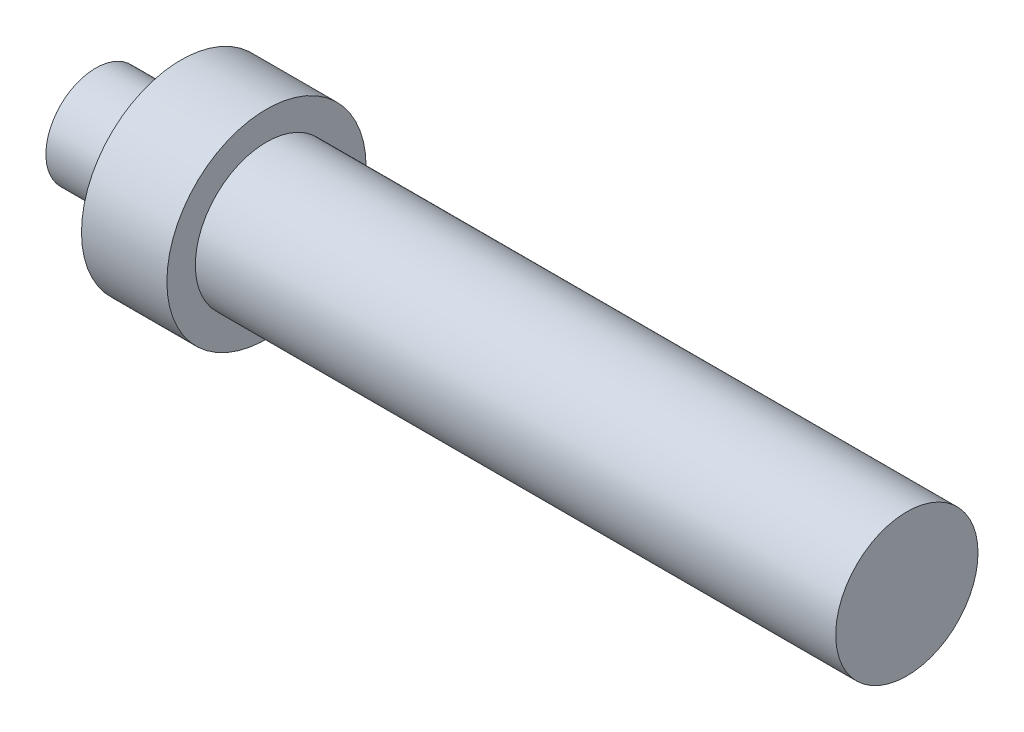
ISO-10303-21;
HEADER;
FILE_DESCRIPTION(('STEP AP214'),'2;1');
FILE_NAME('part.step','',(''),(''),'','','');
FILE_SCHEMA(('AUTOMOTIVE_DESIGN { 1 0 10303 214 1 1 1 1 }'));
ENDSEC;
DATA;
#1=APPLICATION_CONTEXT('core data for automotive mechanical design processes');
#2=APPLICATION_PROTOCOL_DEFINITION('international standard','automotive_design',2000,#1);
#3=PRODUCT_CONTEXT('',#1,'mechanical');
#4=PRODUCT('Part','Part','',(#3));
#5=PRODUCT_RELATED_PRODUCT_CATEGORY('part','',(#4));
#6=PRODUCT_DEFINITION_FORMATION('','',#4);
#7=PRODUCT_DEFINITION_CONTEXT('part definition',#1,'design');
#8=PRODUCT_DEFINITION('design','',#6,#7);
#9=PRODUCT_DEFINITION_SHAPE('','',#8);
#10=(LENGTH_UNIT() NAMED_UNIT(*) SI_UNIT(.MILLI.,.METRE.));
#11=(NAMED_UNIT(*) PLANE_ANGLE_UNIT() SI_UNIT($,.RADIAN.));
#12=(NAMED_UNIT(*) SI_UNIT($,.STERADIAN.) SOLID_ANGLE_UNIT());
#13=UNCERTAINTY_MEASURE_WITH_UNIT(LENGTH_MEASURE(1.E-05),#10,'distance_accuracy_value','');
#14=(GEOMETRIC_REPRESENTATION_CONTEXT(3) GLOBAL_UNCERTAINTY_ASSIGNED_CONTEXT((#13)) GLOBAL_UNIT_ASSIGNED_CONTEXT((#10,
#11,#12)) REPRESENTATION_CONTEXT('',''));
#15=CARTESIAN_POINT('',(0.,0.,0.));
#16=DIRECTION('',(0.,0.,1.));
#17=DIRECTION('',(1.,0.,0.));
#18=AXIS2_PLACEMENT_3D('',#15,#16,#17);
#19=CARTESIAN_POINT('',(-22.5,7.,0.));
#20=DIRECTION('',(-1.,0.,0.));
#21=DIRECTION('',(0.,0.,1.));
#22=AXIS2_PLACEMENT_3D('',#19,#20,#21);
#23=PLANE('',#22);
#24=CARTESIAN_POINT('',(-22.5,0.,0.));
#25=DIRECTION('',(1.,0.,0.));
#26=DIRECTION('',(0.,0.,-1.));
#27=AXIS2_PLACEMENT_3D('',#24,#25,#26);
#28=CIRCLE('',#27,3.5);
#29=CARTESIAN_POINT('',(-22.5,0.,-3.5));
#30=VERTEX_POINT('',#29);
#31=EDGE_CURVE('E10',#30,#30,#28,.T.);
#32=ORIENTED_EDGE('',*,*,#31,.T.);
#33=EDGE_LOOP('',(#32));
#34=FACE_BOUND('',#33,.T.);
#35=CARTESIAN_POINT('',(-22.5,0.,0.));
#36=DIRECTION('',(1.,0.,0.));
#37=DIRECTION('',(0.,0.,-1.));
#38=AXIS2_PLACEMENT_3D('',#35,#36,#37);
#39=CIRCLE('',#38,7.);
#40=CARTESIAN_POINT('',(-22.5,0.,-7.));
#41=VERTEX_POINT('',#40);
#42=EDGE_CURVE('E56',#41,#41,#39,.T.);
#43=ORIENTED_EDGE('',*,*,#42,.F.);
#44=EDGE_LOOP('',(#43));
#45=FACE_BOUND('',#44,.T.);
#46=ADVANCED_FACE('F40',(#34,#45),#23,.T.);
#47=CARTESIAN_POINT('',(28.5,0.,0.));
#48=DIRECTION('',(1.,0.,0.));
#49=DIRECTION('',(0.,0.,-1.));
#50=AXIS2_PLACEMENT_3D('',#47,#48,#49);
#51=CYLINDRICAL_SURFACE('',#50,3.5);
#52=CARTESIAN_POINT('',(-28.5,0.,0.));
#53=DIRECTION('',(1.,0.,0.));
#54=DIRECTION('',(0.,0.,-1.));
#55=AXIS2_PLACEMENT_3D('',#52,#53,#54);
#56=CIRCLE('',#55,3.5);
#57=CARTESIAN_POINT('',(-28.5,0.,-3.5));
#58=VERTEX_POINT('',#57);
#59=EDGE_CURVE('E43',#58,#58,#56,.T.);
#60=ORIENTED_EDGE('',*,*,#59,.T.);
#61=EDGE_LOOP('',(#60));
#62=FACE_BOUND('',#61,.T.);
#63=ORIENTED_EDGE('',*,*,#31,.F.);
#64=EDGE_LOOP('',(#63));
#65=FACE_BOUND('',#64,.T.);
#66=ADVANCED_FACE('F70',(#62,#65),#51,.T.);
#67=CARTESIAN_POINT('',(-28.5,0.,0.));
#68=DIRECTION('',(-1.,0.,0.));
#69=DIRECTION('',(0.,0.,1.));
#70=AXIS2_PLACEMENT_3D('',#67,#68,#69);
#71=PLANE('',#70);
#72=ORIENTED_EDGE('',*,*,#59,.F.);
#73=EDGE_LOOP('',(#72));
#74=FACE_BOUND('',#73,.T.);
#75=ADVANCED_FACE('F71',(#74),#71,.T.);
#76=CARTESIAN_POINT('',(28.5,0.,0.));
#77=DIRECTION('',(1.,0.,0.));
#78=DIRECTION('',(0.,0.,-1.));
#79=AXIS2_PLACEMENT_3D('',#76,#77,#78);
#80=PLANE('',#79);
#81=CARTESIAN_POINT('',(28.5,0.,0.));
#82=DIRECTION('',(1.,0.,0.));
#83=DIRECTION('',(0.,0.,-1.));
#84=AXIS2_PLACEMENT_3D('',#81,#82,#83);
#85=CIRCLE('',#84,5.);
#86=CARTESIAN_POINT('',(28.5,0.,-5.));
#87=VERTEX_POINT('',#86);
#88=EDGE_CURVE('E50',#87,#87,#85,.T.);
#89=ORIENTED_EDGE('',*,*,#88,.T.);
#90=EDGE_LOOP('',(#89));
#91=FACE_BOUND('',#90,.T.);
#92=ADVANCED_FACE('F75',(#91),#80,.T.);
#93=CARTESIAN_POINT('',(28.5,0.,0.));
#94=DIRECTION('',(1.,0.,0.));
#95=DIRECTION('',(0.,0.,-1.));
#96=AXIS2_PLACEMENT_3D('',#93,#94,#95);
#97=CYLINDRICAL_SURFACE('',#96,5.);
#98=CARTESIAN_POINT('',(-16.5,0.,0.));
#99=DIRECTION('',(1.,0.,0.));
#100=DIRECTION('',(0.,0.,-1.));
#101=AXIS2_PLACEMENT_3D('',#98,#99,#100);
#102=CIRCLE('',#101,5.);
#103=CARTESIAN_POINT('',(-16.5,0.,-5.));
#104=VERTEX_POINT('',#103);
#105=EDGE_CURVE('E51',#104,#104,#102,.T.);
#106=ORIENTED_EDGE('',*,*,#105,.T.);
#107=EDGE_LOOP('',(#106));
#108=FACE_BOUND('',#107,.T.);
#109=ORIENTED_EDGE('',*,*,#88,.F.);
#110=EDGE_LOOP('',(#109));
#111=FACE_BOUND('',#110,.T.);
#112=ADVANCED_FACE('F85',(#108,#111),#97,.T.);
#113=CARTESIAN_POINT('',(-16.5,5.,0.));
#114=DIRECTION('',(1.,0.,0.));
#115=DIRECTION('',(0.,0.,-1.));
#116=AXIS2_PLACEMENT_3D('',#113,#114,#115);
#117=PLANE('',#116);
#118=CARTESIAN_POINT('',(-16.5,0.,0.));
#119=DIRECTION('',(1.,0.,0.));
#120=DIRECTION('',(0.,0.,-1.));
#121=AXIS2_PLACEMENT_3D('',#118,#119,#120);
#122=CIRCLE('',#121,7.);
#123=CARTESIAN_POINT('',(-16.5,0.,-7.));
#124=VERTEX_POINT('',#123);
#125=EDGE_CURVE('E57',#124,#124,#122,.T.);
#126=ORIENTED_EDGE('',*,*,#125,.T.);
#127=EDGE_LOOP('',(#126));
#128=FACE_BOUND('',#127,.T.);
#129=ORIENTED_EDGE('',*,*,#105,.F.);
#130=EDGE_LOOP('',(#129));
#131=FACE_BOUND('',#130,.T.);
#132=ADVANCED_FACE('F86',(#128,#131),#117,.T.);
#133=CARTESIAN_POINT('',(28.5,0.,0.));
#134=DIRECTION('',(1.,0.,0.));
#135=DIRECTION('',(0.,0.,-1.));
#136=AXIS2_PLACEMENT_3D('',#133,#134,#135);
#137=CYLINDRICAL_SURFACE('',#136,7.);
#138=ORIENTED_EDGE('',*,*,#42,.T.);
#139=EDGE_LOOP('',(#138));
#140=FACE_BOUND('',#139,.T.);
#141=ORIENTED_EDGE('',*,*,#125,.F.);
#142=EDGE_LOOP('',(#141));
#143=FACE_BOUND('',#142,.T.);
#144=ADVANCED_FACE('F64',(#140,#143),#137,.T.);
#145=CLOSED_SHELL('',(#46,#66,#75,#92,#112,#132,#144));
#146=MANIFOLD_SOLID_BREP('B2',#145);
#147=ADVANCED_BREP_SHAPE_REPRESENTATION('',(#18,#146),#14);
#148=SHAPE_DEFINITION_REPRESENTATION(#9,#147);
ENDSEC;
END-ISO-10303-21;
